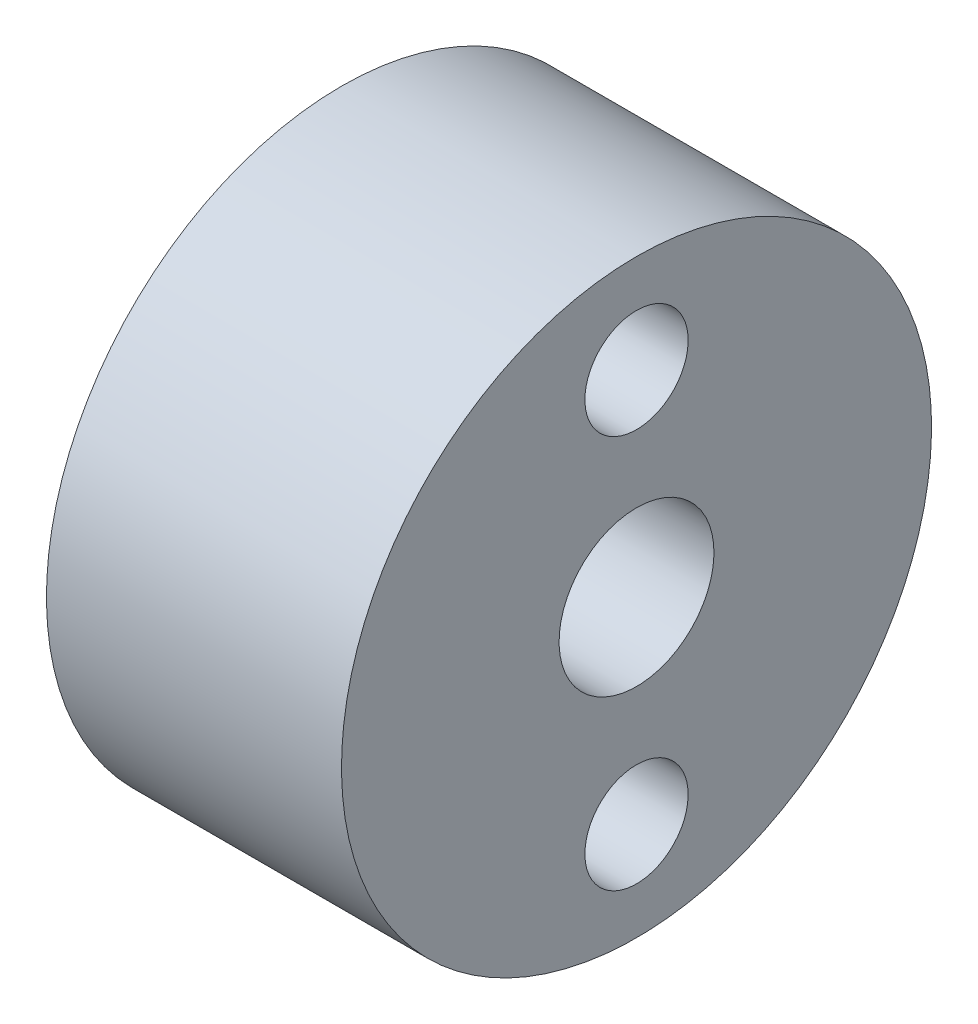
ISO-10303-21;
HEADER;
FILE_DESCRIPTION(('STEP AP214'),'2;1');
FILE_NAME('part.step','',(''),(''),'','','');
FILE_SCHEMA(('AUTOMOTIVE_DESIGN { 1 0 10303 214 1 1 1 1 }'));
ENDSEC;
DATA;
#1=APPLICATION_CONTEXT('core data for automotive mechanical design processes');
#2=APPLICATION_PROTOCOL_DEFINITION('international standard','automotive_design',2000,#1);
#3=PRODUCT_CONTEXT('',#1,'mechanical');
#4=PRODUCT('Part','Part','',(#3));
#5=PRODUCT_RELATED_PRODUCT_CATEGORY('part','',(#4));
#6=PRODUCT_DEFINITION_FORMATION('','',#4);
#7=PRODUCT_DEFINITION_CONTEXT('part definition',#1,'design');
#8=PRODUCT_DEFINITION('design','',#6,#7);
#9=PRODUCT_DEFINITION_SHAPE('','',#8);
#10=(LENGTH_UNIT() NAMED_UNIT(*) SI_UNIT(.MILLI.,.METRE.));
#11=(NAMED_UNIT(*) PLANE_ANGLE_UNIT() SI_UNIT($,.RADIAN.));
#12=(NAMED_UNIT(*) SI_UNIT($,.STERADIAN.) SOLID_ANGLE_UNIT());
#13=UNCERTAINTY_MEASURE_WITH_UNIT(LENGTH_MEASURE(1.E-05),#10,'distance_accuracy_value','');
#14=(GEOMETRIC_REPRESENTATION_CONTEXT(3) GLOBAL_UNCERTAINTY_ASSIGNED_CONTEXT((#13)) GLOBAL_UNIT_ASSIGNED_CONTEXT((#10,
#11,#12)) REPRESENTATION_CONTEXT('',''));
#15=CARTESIAN_POINT('',(0.,0.,0.));
#16=DIRECTION('',(0.,0.,1.));
#17=DIRECTION('',(1.,0.,0.));
#18=AXIS2_PLACEMENT_3D('',#15,#16,#17);
#19=CARTESIAN_POINT('',(25.,-8.,-98.));
#20=DIRECTION('',(1.,0.,0.));
#21=DIRECTION('',(0.,1.,0.));
#22=AXIS2_PLACEMENT_3D('',#19,#20,#21);
#23=PLANE('',#22);
#24=CARTESIAN_POINT('',(25.,-8.,-98.));
#25=DIRECTION('',(1.,0.,0.));
#26=DIRECTION('',(0.,1.,0.));
#27=AXIS2_PLACEMENT_3D('',#24,#25,#26);
#28=CIRCLE('',#27,2.1);
#29=CARTESIAN_POINT('',(25.,-5.9,-98.));
#30=VERTEX_POINT('',#29);
#31=EDGE_CURVE('E11',#30,#30,#28,.T.);
#32=ORIENTED_EDGE('',*,*,#31,.T.);
#33=EDGE_LOOP('',(#32));
#34=FACE_BOUND('',#33,.T.);
#35=ADVANCED_FACE('F17',(#34),#23,.T.);
#36=CARTESIAN_POINT('',(25.,8.,-98.));
#37=DIRECTION('',(1.,0.,0.));
#38=DIRECTION('',(0.,1.,0.));
#39=AXIS2_PLACEMENT_3D('',#36,#37,#38);
#40=PLANE('',#39);
#41=CARTESIAN_POINT('',(25.,8.,-98.));
#42=DIRECTION('',(1.,0.,0.));
#43=DIRECTION('',(0.,1.,0.));
#44=AXIS2_PLACEMENT_3D('',#41,#42,#43);
#45=CIRCLE('',#44,2.1);
#46=CARTESIAN_POINT('',(25.,10.1,-98.));
#47=VERTEX_POINT('',#46);
#48=EDGE_CURVE('E42',#47,#47,#45,.T.);
#49=ORIENTED_EDGE('',*,*,#48,.T.);
#50=EDGE_LOOP('',(#49));
#51=FACE_BOUND('',#50,.T.);
#52=ADVANCED_FACE('F132',(#51),#40,.T.);
#53=CARTESIAN_POINT('',(25.,-8.,-98.));
#54=DIRECTION('',(-1.,0.,0.));
#55=DIRECTION('',(0.,1.,0.));
#56=AXIS2_PLACEMENT_3D('',#53,#54,#55);
#57=CYLINDRICAL_SURFACE('',#56,2.1);
#58=DIRECTION('',(1.,0.,0.));
#59=VECTOR('',#58,1.);
#60=CARTESIAN_POINT('',(25.,-5.9,-98.));
#61=LINE('',#60,#59);
#62=CARTESIAN_POINT('',(31.,-5.9,-98.));
#63=VERTEX_POINT('',#62);
#64=EDGE_CURVE('E21',#30,#63,#61,.T.);
#65=ORIENTED_EDGE('',*,*,#64,.T.);
#66=CARTESIAN_POINT('',(31.,-8.,-98.));
#67=DIRECTION('',(1.,0.,0.));
#68=DIRECTION('',(0.,1.,0.));
#69=AXIS2_PLACEMENT_3D('',#66,#67,#68);
#70=CIRCLE('',#69,2.1);
#71=EDGE_CURVE('E96',#63,#63,#70,.T.);
#72=ORIENTED_EDGE('',*,*,#71,.T.);
#73=ORIENTED_EDGE('',*,*,#64,.F.);
#74=ORIENTED_EDGE('',*,*,#31,.F.);
#75=EDGE_LOOP('',(#65,#72,#73,#74));
#76=FACE_BOUND('',#75,.T.);
#77=ADVANCED_FACE('F19',(#76),#57,.F.);
#78=CARTESIAN_POINT('',(25.,8.,-98.));
#79=DIRECTION('',(-1.,0.,0.));
#80=DIRECTION('',(0.,1.,0.));
#81=AXIS2_PLACEMENT_3D('',#78,#79,#80);
#82=CYLINDRICAL_SURFACE('',#81,2.1);
#83=DIRECTION('',(1.,0.,0.));
#84=VECTOR('',#83,1.);
#85=CARTESIAN_POINT('',(25.,10.1,-98.));
#86=LINE('',#85,#84);
#87=CARTESIAN_POINT('',(31.,10.1,-98.));
#88=VERTEX_POINT('',#87);
#89=EDGE_CURVE('E103',#47,#88,#86,.T.);
#90=ORIENTED_EDGE('',*,*,#89,.T.);
#91=CARTESIAN_POINT('',(31.,8.,-98.));
#92=DIRECTION('',(1.,0.,0.));
#93=DIRECTION('',(0.,1.,0.));
#94=AXIS2_PLACEMENT_3D('',#91,#92,#93);
#95=CIRCLE('',#94,2.1);
#96=EDGE_CURVE('E87',#88,#88,#95,.T.);
#97=ORIENTED_EDGE('',*,*,#96,.T.);
#98=ORIENTED_EDGE('',*,*,#89,.F.);
#99=ORIENTED_EDGE('',*,*,#48,.F.);
#100=EDGE_LOOP('',(#90,#97,#98,#99));
#101=FACE_BOUND('',#100,.T.);
#102=ADVANCED_FACE('F110',(#101),#82,.F.);
#103=CARTESIAN_POINT('',(18.,0.,-98.));
#104=DIRECTION('',(-1.,0.,0.));
#105=DIRECTION('',(0.,1.,0.));
#106=AXIS2_PLACEMENT_3D('',#103,#104,#105);
#107=CYLINDRICAL_SURFACE('',#106,3.15);
#108=CARTESIAN_POINT('',(19.,0.,-98.));
#109=DIRECTION('',(-1.,0.,0.));
#110=DIRECTION('',(0.,1.,0.));
#111=AXIS2_PLACEMENT_3D('',#108,#109,#110);
#112=CIRCLE('',#111,3.15);
#113=CARTESIAN_POINT('',(19.,3.15,-98.));
#114=VERTEX_POINT('',#113);
#115=EDGE_CURVE('E81',#114,#114,#112,.T.);
#116=ORIENTED_EDGE('',*,*,#115,.T.);
#117=DIRECTION('',(1.,0.,0.));
#118=VECTOR('',#117,1.);
#119=CARTESIAN_POINT('',(18.,3.15,-98.));
#120=LINE('',#119,#118);
#121=CARTESIAN_POINT('',(31.,3.15,-98.));
#122=VERTEX_POINT('',#121);
#123=EDGE_CURVE('E100',#114,#122,#120,.T.);
#124=ORIENTED_EDGE('',*,*,#123,.T.);
#125=CARTESIAN_POINT('',(31.,0.,-98.));
#126=DIRECTION('',(-1.,0.,0.));
#127=DIRECTION('',(0.,1.,0.));
#128=AXIS2_PLACEMENT_3D('',#125,#126,#127);
#129=CIRCLE('',#128,3.15);
#130=EDGE_CURVE('E92',#122,#122,#129,.T.);
#131=ORIENTED_EDGE('',*,*,#130,.F.);
#132=ORIENTED_EDGE('',*,*,#123,.F.);
#133=EDGE_LOOP('',(#116,#124,#131,#132));
#134=FACE_BOUND('',#133,.T.);
#135=ADVANCED_FACE('F117',(#134),#107,.F.);
#136=CARTESIAN_POINT('',(31.,0.,-98.));
#137=DIRECTION('',(1.,0.,0.));
#138=DIRECTION('',(0.,1.,0.));
#139=AXIS2_PLACEMENT_3D('',#136,#137,#138);
#140=PLANE('',#139);
#141=ORIENTED_EDGE('',*,*,#71,.F.);
#142=EDGE_LOOP('',(#141));
#143=FACE_BOUND('',#142,.T.);
#144=ORIENTED_EDGE('',*,*,#130,.T.);
#145=EDGE_LOOP('',(#144));
#146=FACE_BOUND('',#145,.T.);
#147=ORIENTED_EDGE('',*,*,#96,.F.);
#148=EDGE_LOOP('',(#147));
#149=FACE_BOUND('',#148,.T.);
#150=CARTESIAN_POINT('',(31.,0.,-98.));
#151=DIRECTION('',(1.,0.,0.));
#152=DIRECTION('',(0.,1.,0.));
#153=AXIS2_PLACEMENT_3D('',#150,#151,#152);
#154=CIRCLE('',#153,12.);
#155=CARTESIAN_POINT('',(31.,12.,-98.));
#156=VERTEX_POINT('',#155);
#157=EDGE_CURVE('E75',#156,#156,#154,.T.);
#158=ORIENTED_EDGE('',*,*,#157,.T.);
#159=EDGE_LOOP('',(#158));
#160=FACE_BOUND('',#159,.T.);
#161=ADVANCED_FACE('F113',(#143,#146,#149,#160),#140,.T.);
#162=CARTESIAN_POINT('',(19.,0.,-98.));
#163=DIRECTION('',(1.,0.,0.));
#164=DIRECTION('',(0.,1.,0.));
#165=AXIS2_PLACEMENT_3D('',#162,#163,#164);
#166=PLANE('',#165);
#167=ORIENTED_EDGE('',*,*,#115,.F.);
#168=EDGE_LOOP('',(#167));
#169=FACE_BOUND('',#168,.T.);
#170=CARTESIAN_POINT('',(19.,0.,-98.));
#171=DIRECTION('',(1.,0.,0.));
#172=DIRECTION('',(0.,1.,0.));
#173=AXIS2_PLACEMENT_3D('',#170,#171,#172);
#174=CIRCLE('',#173,12.);
#175=CARTESIAN_POINT('',(19.,12.,-98.));
#176=VERTEX_POINT('',#175);
#177=EDGE_CURVE('E74',#176,#176,#174,.T.);
#178=ORIENTED_EDGE('',*,*,#177,.F.);
#179=EDGE_LOOP('',(#178));
#180=FACE_BOUND('',#179,.T.);
#181=ADVANCED_FACE('F116',(#169,#180),#166,.F.);
#182=CARTESIAN_POINT('',(19.,0.,-98.));
#183=DIRECTION('',(-1.,0.,0.));
#184=DIRECTION('',(0.,1.,0.));
#185=AXIS2_PLACEMENT_3D('',#182,#183,#184);
#186=CYLINDRICAL_SURFACE('',#185,12.);
#187=ORIENTED_EDGE('',*,*,#177,.T.);
#188=DIRECTION('',(1.,0.,0.));
#189=VECTOR('',#188,1.);
#190=CARTESIAN_POINT('',(19.,12.,-98.));
#191=LINE('',#190,#189);
#192=EDGE_CURVE('E71',#176,#156,#191,.T.);
#193=ORIENTED_EDGE('',*,*,#192,.T.);
#194=ORIENTED_EDGE('',*,*,#157,.F.);
#195=ORIENTED_EDGE('',*,*,#192,.F.);
#196=EDGE_LOOP('',(#187,#193,#194,#195));
#197=FACE_BOUND('',#196,.T.);
#198=ADVANCED_FACE('F72',(#197),#186,.T.);
#199=CLOSED_SHELL('',(#35,#52,#77,#102,#135,#161,#181,#198));
#200=MANIFOLD_SOLID_BREP('B1',#199);
#201=ADVANCED_BREP_SHAPE_REPRESENTATION('',(#18,#200),#14);
#202=SHAPE_DEFINITION_REPRESENTATION(#9,#201);
ENDSEC;
END-ISO-10303-21;
